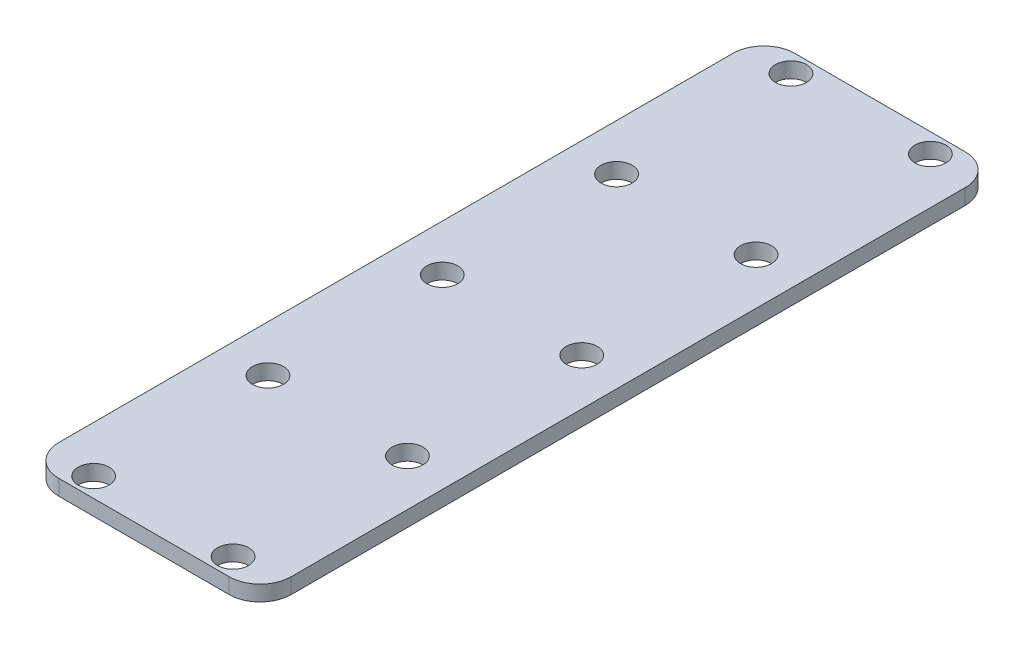
ISO-10303-21;
HEADER;
FILE_DESCRIPTION(('STEP AP214'),'2;1');
FILE_NAME('part.step','',(''),(''),'','','');
FILE_SCHEMA(('AUTOMOTIVE_DESIGN { 1 0 10303 214 1 1 1 1 }'));
ENDSEC;
DATA;
#1=APPLICATION_CONTEXT('core data for automotive mechanical design processes');
#2=APPLICATION_PROTOCOL_DEFINITION('international standard','automotive_design',2000,#1);
#3=PRODUCT_CONTEXT('',#1,'mechanical');
#4=PRODUCT('Part','Part','',(#3));
#5=PRODUCT_RELATED_PRODUCT_CATEGORY('part','',(#4));
#6=PRODUCT_DEFINITION_FORMATION('','',#4);
#7=PRODUCT_DEFINITION_CONTEXT('part definition',#1,'design');
#8=PRODUCT_DEFINITION('design','',#6,#7);
#9=PRODUCT_DEFINITION_SHAPE('','',#8);
#10=(LENGTH_UNIT() NAMED_UNIT(*) SI_UNIT(.MILLI.,.METRE.));
#11=(NAMED_UNIT(*) PLANE_ANGLE_UNIT() SI_UNIT($,.RADIAN.));
#12=(NAMED_UNIT(*) SI_UNIT($,.STERADIAN.) SOLID_ANGLE_UNIT());
#13=UNCERTAINTY_MEASURE_WITH_UNIT(LENGTH_MEASURE(1.E-05),#10,'distance_accuracy_value','');
#14=(GEOMETRIC_REPRESENTATION_CONTEXT(3) GLOBAL_UNCERTAINTY_ASSIGNED_CONTEXT((#13)) GLOBAL_UNIT_ASSIGNED_CONTEXT((#10,
#11,#12)) REPRESENTATION_CONTEXT('',''));
#15=CARTESIAN_POINT('',(0.,0.,0.));
#16=DIRECTION('',(0.,0.,1.));
#17=DIRECTION('',(1.,0.,0.));
#18=AXIS2_PLACEMENT_3D('',#15,#16,#17);
#19=CARTESIAN_POINT('',(0.,0.,0.));
#20=DIRECTION('',(0.,1.,0.));
#21=DIRECTION('',(1.,0.,0.));
#22=AXIS2_PLACEMENT_3D('',#19,#20,#21);
#23=PLANE('',#22);
#24=CARTESIAN_POINT('',(-9.,0.,0.));
#25=DIRECTION('',(0.,1.,0.));
#26=DIRECTION('',(0.,0.,1.));
#27=AXIS2_PLACEMENT_3D('',#24,#25,#26);
#28=CIRCLE('',#27,2.);
#29=CARTESIAN_POINT('',(-9.,0.,2.));
#30=VERTEX_POINT('',#29);
#31=EDGE_CURVE('E143',#30,#30,#28,.T.);
#32=ORIENTED_EDGE('',*,*,#31,.T.);
#33=EDGE_LOOP('',(#32));
#34=FACE_BOUND('',#33,.T.);
#35=CARTESIAN_POINT('',(-9.,0.,22.5));
#36=DIRECTION('',(0.,1.,0.));
#37=DIRECTION('',(0.,0.,1.));
#38=AXIS2_PLACEMENT_3D('',#35,#36,#37);
#39=CIRCLE('',#38,2.);
#40=CARTESIAN_POINT('',(-9.,0.,24.5));
#41=VERTEX_POINT('',#40);
#42=EDGE_CURVE('E180',#41,#41,#39,.T.);
#43=ORIENTED_EDGE('',*,*,#42,.T.);
#44=EDGE_LOOP('',(#43));
#45=FACE_BOUND('',#44,.T.);
#46=CARTESIAN_POINT('',(9.,0.,22.5));
#47=DIRECTION('',(0.,1.,0.));
#48=DIRECTION('',(0.,0.,1.));
#49=AXIS2_PLACEMENT_3D('',#46,#47,#48);
#50=CIRCLE('',#49,2.);
#51=CARTESIAN_POINT('',(9.,0.,24.5));
#52=VERTEX_POINT('',#51);
#53=EDGE_CURVE('E183',#52,#52,#50,.T.);
#54=ORIENTED_EDGE('',*,*,#53,.T.);
#55=EDGE_LOOP('',(#54));
#56=FACE_BOUND('',#55,.T.);
#57=CARTESIAN_POINT('',(-9.,0.,45.));
#58=DIRECTION('',(0.,1.,0.));
#59=DIRECTION('',(0.,0.,1.));
#60=AXIS2_PLACEMENT_3D('',#57,#58,#59);
#61=CIRCLE('',#60,2.);
#62=CARTESIAN_POINT('',(-9.,0.,47.));
#63=VERTEX_POINT('',#62);
#64=EDGE_CURVE('E186',#63,#63,#61,.T.);
#65=ORIENTED_EDGE('',*,*,#64,.T.);
#66=EDGE_LOOP('',(#65));
#67=FACE_BOUND('',#66,.T.);
#68=CARTESIAN_POINT('',(9.,0.,-45.));
#69=DIRECTION('',(0.,1.,0.));
#70=DIRECTION('',(0.,0.,1.));
#71=AXIS2_PLACEMENT_3D('',#68,#69,#70);
#72=CIRCLE('',#71,2.);
#73=CARTESIAN_POINT('',(9.,0.,-43.));
#74=VERTEX_POINT('',#73);
#75=EDGE_CURVE('E189',#74,#74,#72,.T.);
#76=ORIENTED_EDGE('',*,*,#75,.T.);
#77=EDGE_LOOP('',(#76));
#78=FACE_BOUND('',#77,.T.);
#79=CARTESIAN_POINT('',(-9.,0.,-22.5));
#80=DIRECTION('',(0.,1.,0.));
#81=DIRECTION('',(0.,0.,1.));
#82=AXIS2_PLACEMENT_3D('',#79,#80,#81);
#83=CIRCLE('',#82,2.00421482960565);
#84=CARTESIAN_POINT('',(-9.,0.,-20.4957851703943));
#85=VERTEX_POINT('',#84);
#86=EDGE_CURVE('E192',#85,#85,#83,.T.);
#87=ORIENTED_EDGE('',*,*,#86,.T.);
#88=EDGE_LOOP('',(#87));
#89=FACE_BOUND('',#88,.T.);
#90=CARTESIAN_POINT('',(9.,0.,-22.5));
#91=DIRECTION('',(0.,1.,0.));
#92=DIRECTION('',(0.,0.,1.));
#93=AXIS2_PLACEMENT_3D('',#90,#91,#92);
#94=CIRCLE('',#93,2.);
#95=CARTESIAN_POINT('',(9.,0.,-20.5));
#96=VERTEX_POINT('',#95);
#97=EDGE_CURVE('E195',#96,#96,#94,.T.);
#98=ORIENTED_EDGE('',*,*,#97,.T.);
#99=EDGE_LOOP('',(#98));
#100=FACE_BOUND('',#99,.T.);
#101=CARTESIAN_POINT('',(9.,0.,0.));
#102=DIRECTION('',(0.,1.,0.));
#103=DIRECTION('',(0.,0.,1.));
#104=AXIS2_PLACEMENT_3D('',#101,#102,#103);
#105=CIRCLE('',#104,2.);
#106=CARTESIAN_POINT('',(9.,0.,2.));
#107=VERTEX_POINT('',#106);
#108=EDGE_CURVE('E198',#107,#107,#105,.T.);
#109=ORIENTED_EDGE('',*,*,#108,.T.);
#110=EDGE_LOOP('',(#109));
#111=FACE_BOUND('',#110,.T.);
#112=CARTESIAN_POINT('',(9.,0.,45.));
#113=DIRECTION('',(0.,1.,0.));
#114=DIRECTION('',(0.,0.,1.));
#115=AXIS2_PLACEMENT_3D('',#112,#113,#114);
#116=CIRCLE('',#115,2.);
#117=CARTESIAN_POINT('',(9.,0.,47.));
#118=VERTEX_POINT('',#117);
#119=EDGE_CURVE('E201',#118,#118,#116,.T.);
#120=ORIENTED_EDGE('',*,*,#119,.T.);
#121=EDGE_LOOP('',(#120));
#122=FACE_BOUND('',#121,.T.);
#123=CARTESIAN_POINT('',(-9.,0.,-45.));
#124=DIRECTION('',(0.,1.,0.));
#125=DIRECTION('',(0.,0.,1.));
#126=AXIS2_PLACEMENT_3D('',#123,#124,#125);
#127=CIRCLE('',#126,2.);
#128=CARTESIAN_POINT('',(-9.,0.,-43.));
#129=VERTEX_POINT('',#128);
#130=EDGE_CURVE('E204',#129,#129,#127,.T.);
#131=ORIENTED_EDGE('',*,*,#130,.T.);
#132=EDGE_LOOP('',(#131));
#133=FACE_BOUND('',#132,.T.);
#134=DIRECTION('',(1.,0.,0.));
#135=VECTOR('',#134,1.);
#136=CARTESIAN_POINT('',(-11.,0.,47.5));
#137=LINE('',#136,#135);
#138=CARTESIAN_POINT('',(-11.,0.,47.5));
#139=VERTEX_POINT('',#138);
#140=CARTESIAN_POINT('',(11.,0.,47.5));
#141=VERTEX_POINT('',#140);
#142=EDGE_CURVE('E60',#139,#141,#137,.T.);
#143=ORIENTED_EDGE('',*,*,#142,.F.);
#144=CARTESIAN_POINT('',(-11.,0.,43.5));
#145=DIRECTION('',(0.,-1.,0.));
#146=DIRECTION('',(0.,0.,1.));
#147=AXIS2_PLACEMENT_3D('',#144,#145,#146);
#148=CIRCLE('',#147,4.);
#149=CARTESIAN_POINT('',(-15.,0.,43.5));
#150=VERTEX_POINT('',#149);
#151=EDGE_CURVE('E11',#139,#150,#148,.T.);
#152=ORIENTED_EDGE('',*,*,#151,.T.);
#153=DIRECTION('',(0.,0.,1.));
#154=VECTOR('',#153,1.);
#155=CARTESIAN_POINT('',(-15.,0.,-43.5));
#156=LINE('',#155,#154);
#157=CARTESIAN_POINT('',(-15.,0.,-43.5));
#158=VERTEX_POINT('',#157);
#159=EDGE_CURVE('E131',#158,#150,#156,.T.);
#160=ORIENTED_EDGE('',*,*,#159,.F.);
#161=CARTESIAN_POINT('',(-11.,0.,-43.5));
#162=DIRECTION('',(0.,-1.,0.));
#163=DIRECTION('',(-1.,0.,0.));
#164=AXIS2_PLACEMENT_3D('',#161,#162,#163);
#165=CIRCLE('',#164,4.);
#166=CARTESIAN_POINT('',(-11.,0.,-47.5));
#167=VERTEX_POINT('',#166);
#168=EDGE_CURVE('E52',#158,#167,#165,.T.);
#169=ORIENTED_EDGE('',*,*,#168,.T.);
#170=DIRECTION('',(1.,0.,0.));
#171=VECTOR('',#170,1.);
#172=CARTESIAN_POINT('',(-11.,0.,-47.5));
#173=LINE('',#172,#171);
#174=CARTESIAN_POINT('',(11.,0.,-47.5));
#175=VERTEX_POINT('',#174);
#176=EDGE_CURVE('E144',#167,#175,#173,.T.);
#177=ORIENTED_EDGE('',*,*,#176,.T.);
#178=CARTESIAN_POINT('',(11.,0.,-43.5));
#179=DIRECTION('',(0.,-1.,0.));
#180=DIRECTION('',(0.,0.,-1.));
#181=AXIS2_PLACEMENT_3D('',#178,#179,#180);
#182=CIRCLE('',#181,4.);
#183=CARTESIAN_POINT('',(15.,0.,-43.5));
#184=VERTEX_POINT('',#183);
#185=EDGE_CURVE('E147',#175,#184,#182,.T.);
#186=ORIENTED_EDGE('',*,*,#185,.T.);
#187=DIRECTION('',(0.,0.,-1.));
#188=VECTOR('',#187,1.);
#189=CARTESIAN_POINT('',(15.,0.,43.5));
#190=LINE('',#189,#188);
#191=CARTESIAN_POINT('',(15.,0.,43.5));
#192=VERTEX_POINT('',#191);
#193=EDGE_CURVE('E159',#192,#184,#190,.T.);
#194=ORIENTED_EDGE('',*,*,#193,.F.);
#195=CARTESIAN_POINT('',(11.,0.,43.5));
#196=DIRECTION('',(0.,-1.,0.));
#197=DIRECTION('',(1.,0.,0.));
#198=AXIS2_PLACEMENT_3D('',#195,#196,#197);
#199=CIRCLE('',#198,4.);
#200=EDGE_CURVE('E165',#192,#141,#199,.T.);
#201=ORIENTED_EDGE('',*,*,#200,.T.);
#202=EDGE_LOOP('',(#143,#152,#160,#169,#177,#186,#194,#201));
#203=FACE_BOUND('',#202,.T.);
#204=ADVANCED_FACE('F42',(#34,#45,#56,#67,#78,#89,#100,#111,#122,#133,#203),#23,.F.);
#205=CARTESIAN_POINT('',(0.,2.,0.));
#206=DIRECTION('',(0.,1.,0.));
#207=DIRECTION('',(1.,0.,0.));
#208=AXIS2_PLACEMENT_3D('',#205,#206,#207);
#209=PLANE('',#208);
#210=CARTESIAN_POINT('',(-9.,2.,0.));
#211=DIRECTION('',(0.,1.,0.));
#212=DIRECTION('',(0.,0.,1.));
#213=AXIS2_PLACEMENT_3D('',#210,#211,#212);
#214=CIRCLE('',#213,2.);
#215=CARTESIAN_POINT('',(-9.,2.,2.));
#216=VERTEX_POINT('',#215);
#217=EDGE_CURVE('E220',#216,#216,#214,.T.);
#218=ORIENTED_EDGE('',*,*,#217,.F.);
#219=EDGE_LOOP('',(#218));
#220=FACE_BOUND('',#219,.T.);
#221=CARTESIAN_POINT('',(-9.,2.,22.5));
#222=DIRECTION('',(0.,1.,0.));
#223=DIRECTION('',(0.,0.,1.));
#224=AXIS2_PLACEMENT_3D('',#221,#222,#223);
#225=CIRCLE('',#224,2.);
#226=CARTESIAN_POINT('',(-9.,2.,24.5));
#227=VERTEX_POINT('',#226);
#228=EDGE_CURVE('E223',#227,#227,#225,.T.);
#229=ORIENTED_EDGE('',*,*,#228,.F.);
#230=EDGE_LOOP('',(#229));
#231=FACE_BOUND('',#230,.T.);
#232=CARTESIAN_POINT('',(9.,2.,22.5));
#233=DIRECTION('',(0.,1.,0.));
#234=DIRECTION('',(0.,0.,1.));
#235=AXIS2_PLACEMENT_3D('',#232,#233,#234);
#236=CIRCLE('',#235,2.);
#237=CARTESIAN_POINT('',(9.,2.,24.5));
#238=VERTEX_POINT('',#237);
#239=EDGE_CURVE('E226',#238,#238,#236,.T.);
#240=ORIENTED_EDGE('',*,*,#239,.F.);
#241=EDGE_LOOP('',(#240));
#242=FACE_BOUND('',#241,.T.);
#243=CARTESIAN_POINT('',(-9.,2.,45.));
#244=DIRECTION('',(0.,1.,0.));
#245=DIRECTION('',(0.,0.,1.));
#246=AXIS2_PLACEMENT_3D('',#243,#244,#245);
#247=CIRCLE('',#246,2.);
#248=CARTESIAN_POINT('',(-9.,2.,47.));
#249=VERTEX_POINT('',#248);
#250=EDGE_CURVE('E229',#249,#249,#247,.T.);
#251=ORIENTED_EDGE('',*,*,#250,.F.);
#252=EDGE_LOOP('',(#251));
#253=FACE_BOUND('',#252,.T.);
#254=CARTESIAN_POINT('',(9.,2.,-45.));
#255=DIRECTION('',(0.,1.,0.));
#256=DIRECTION('',(0.,0.,1.));
#257=AXIS2_PLACEMENT_3D('',#254,#255,#256);
#258=CIRCLE('',#257,2.);
#259=CARTESIAN_POINT('',(9.,2.,-43.));
#260=VERTEX_POINT('',#259);
#261=EDGE_CURVE('E210',#260,#260,#258,.T.);
#262=ORIENTED_EDGE('',*,*,#261,.F.);
#263=EDGE_LOOP('',(#262));
#264=FACE_BOUND('',#263,.T.);
#265=CARTESIAN_POINT('',(-9.,2.,-22.5));
#266=DIRECTION('',(0.,1.,0.));
#267=DIRECTION('',(0.,0.,1.));
#268=AXIS2_PLACEMENT_3D('',#265,#266,#267);
#269=CIRCLE('',#268,2.00421482960565);
#270=CARTESIAN_POINT('',(-9.,2.,-20.4957851703943));
#271=VERTEX_POINT('',#270);
#272=EDGE_CURVE('E211',#271,#271,#269,.T.);
#273=ORIENTED_EDGE('',*,*,#272,.F.);
#274=EDGE_LOOP('',(#273));
#275=FACE_BOUND('',#274,.T.);
#276=CARTESIAN_POINT('',(9.,2.,-22.5));
#277=DIRECTION('',(0.,1.,0.));
#278=DIRECTION('',(0.,0.,1.));
#279=AXIS2_PLACEMENT_3D('',#276,#277,#278);
#280=CIRCLE('',#279,2.);
#281=CARTESIAN_POINT('',(9.,2.,-20.5));
#282=VERTEX_POINT('',#281);
#283=EDGE_CURVE('E214',#282,#282,#280,.T.);
#284=ORIENTED_EDGE('',*,*,#283,.F.);
#285=EDGE_LOOP('',(#284));
#286=FACE_BOUND('',#285,.T.);
#287=CARTESIAN_POINT('',(9.,2.,0.));
#288=DIRECTION('',(0.,1.,0.));
#289=DIRECTION('',(0.,0.,1.));
#290=AXIS2_PLACEMENT_3D('',#287,#288,#289);
#291=CIRCLE('',#290,2.);
#292=CARTESIAN_POINT('',(9.,2.,2.));
#293=VERTEX_POINT('',#292);
#294=EDGE_CURVE('E217',#293,#293,#291,.T.);
#295=ORIENTED_EDGE('',*,*,#294,.F.);
#296=EDGE_LOOP('',(#295));
#297=FACE_BOUND('',#296,.T.);
#298=CARTESIAN_POINT('',(9.,2.,45.));
#299=DIRECTION('',(0.,1.,0.));
#300=DIRECTION('',(0.,0.,1.));
#301=AXIS2_PLACEMENT_3D('',#298,#299,#300);
#302=CIRCLE('',#301,2.);
#303=CARTESIAN_POINT('',(9.,2.,47.));
#304=VERTEX_POINT('',#303);
#305=EDGE_CURVE('E232',#304,#304,#302,.T.);
#306=ORIENTED_EDGE('',*,*,#305,.F.);
#307=EDGE_LOOP('',(#306));
#308=FACE_BOUND('',#307,.T.);
#309=CARTESIAN_POINT('',(-9.,2.,-45.));
#310=DIRECTION('',(0.,1.,0.));
#311=DIRECTION('',(0.,0.,1.));
#312=AXIS2_PLACEMENT_3D('',#309,#310,#311);
#313=CIRCLE('',#312,2.);
#314=CARTESIAN_POINT('',(-9.,2.,-43.));
#315=VERTEX_POINT('',#314);
#316=EDGE_CURVE('E207',#315,#315,#313,.T.);
#317=ORIENTED_EDGE('',*,*,#316,.F.);
#318=EDGE_LOOP('',(#317));
#319=FACE_BOUND('',#318,.T.);
#320=DIRECTION('',(0.,0.,-1.));
#321=VECTOR('',#320,1.);
#322=CARTESIAN_POINT('',(15.,2.,43.5));
#323=LINE('',#322,#321);
#324=CARTESIAN_POINT('',(15.,2.,43.5));
#325=VERTEX_POINT('',#324);
#326=CARTESIAN_POINT('',(15.,2.,-43.5));
#327=VERTEX_POINT('',#326);
#328=EDGE_CURVE('E164',#325,#327,#323,.T.);
#329=ORIENTED_EDGE('',*,*,#328,.T.);
#330=CARTESIAN_POINT('',(11.,2.,-43.5));
#331=DIRECTION('',(0.,1.,0.));
#332=DIRECTION('',(1.,0.,0.));
#333=AXIS2_PLACEMENT_3D('',#330,#331,#332);
#334=CIRCLE('',#333,4.);
#335=CARTESIAN_POINT('',(11.,2.,-47.5));
#336=VERTEX_POINT('',#335);
#337=EDGE_CURVE('E166',#327,#336,#334,.T.);
#338=ORIENTED_EDGE('',*,*,#337,.T.);
#339=DIRECTION('',(1.,0.,0.));
#340=VECTOR('',#339,1.);
#341=CARTESIAN_POINT('',(-11.,2.,-47.5));
#342=LINE('',#341,#340);
#343=CARTESIAN_POINT('',(-11.,2.,-47.5));
#344=VERTEX_POINT('',#343);
#345=EDGE_CURVE('E92',#344,#336,#342,.T.);
#346=ORIENTED_EDGE('',*,*,#345,.F.);
#347=CARTESIAN_POINT('',(-11.,2.,-43.5));
#348=DIRECTION('',(0.,1.,0.));
#349=DIRECTION('',(0.,0.,-1.));
#350=AXIS2_PLACEMENT_3D('',#347,#348,#349);
#351=CIRCLE('',#350,4.);
#352=CARTESIAN_POINT('',(-15.,2.,-43.5));
#353=VERTEX_POINT('',#352);
#354=EDGE_CURVE('E125',#344,#353,#351,.T.);
#355=ORIENTED_EDGE('',*,*,#354,.T.);
#356=DIRECTION('',(0.,0.,1.));
#357=VECTOR('',#356,1.);
#358=CARTESIAN_POINT('',(-15.,2.,-43.5));
#359=LINE('',#358,#357);
#360=CARTESIAN_POINT('',(-15.,2.,43.5));
#361=VERTEX_POINT('',#360);
#362=EDGE_CURVE('E120',#353,#361,#359,.T.);
#363=ORIENTED_EDGE('',*,*,#362,.T.);
#364=CARTESIAN_POINT('',(-11.,2.,43.5));
#365=DIRECTION('',(0.,1.,0.));
#366=DIRECTION('',(-1.,0.,0.));
#367=AXIS2_PLACEMENT_3D('',#364,#365,#366);
#368=CIRCLE('',#367,4.);
#369=CARTESIAN_POINT('',(-11.,2.,47.5));
#370=VERTEX_POINT('',#369);
#371=EDGE_CURVE('E112',#361,#370,#368,.T.);
#372=ORIENTED_EDGE('',*,*,#371,.T.);
#373=DIRECTION('',(1.,0.,0.));
#374=VECTOR('',#373,1.);
#375=CARTESIAN_POINT('',(-11.,2.,47.5));
#376=LINE('',#375,#374);
#377=CARTESIAN_POINT('',(11.,2.,47.5));
#378=VERTEX_POINT('',#377);
#379=EDGE_CURVE('E121',#370,#378,#376,.T.);
#380=ORIENTED_EDGE('',*,*,#379,.T.);
#381=CARTESIAN_POINT('',(11.,2.,43.5));
#382=DIRECTION('',(0.,1.,0.));
#383=DIRECTION('',(0.,0.,1.));
#384=AXIS2_PLACEMENT_3D('',#381,#382,#383);
#385=CIRCLE('',#384,4.);
#386=EDGE_CURVE('E148',#378,#325,#385,.T.);
#387=ORIENTED_EDGE('',*,*,#386,.T.);
#388=EDGE_LOOP('',(#329,#338,#346,#355,#363,#372,#380,#387));
#389=FACE_BOUND('',#388,.T.);
#390=ADVANCED_FACE('F124',(#220,#231,#242,#253,#264,#275,#286,#297,#308,#319,#389),#209,.T.);
#391=CARTESIAN_POINT('',(11.,7.012,43.5));
#392=DIRECTION('',(0.,-1.,0.));
#393=DIRECTION('',(1.,0.,0.));
#394=AXIS2_PLACEMENT_3D('',#391,#392,#393);
#395=CYLINDRICAL_SURFACE('',#394,4.);
#396=DIRECTION('',(0.,-1.,0.));
#397=VECTOR('',#396,1.);
#398=CARTESIAN_POINT('',(15.,2.,43.5));
#399=LINE('',#398,#397);
#400=EDGE_CURVE('E139',#325,#192,#399,.T.);
#401=ORIENTED_EDGE('',*,*,#400,.F.);
#402=ORIENTED_EDGE('',*,*,#386,.F.);
#403=DIRECTION('',(0.,-1.,0.));
#404=VECTOR('',#403,1.);
#405=CARTESIAN_POINT('',(11.,2.,47.5));
#406=LINE('',#405,#404);
#407=EDGE_CURVE('E46',#378,#141,#406,.T.);
#408=ORIENTED_EDGE('',*,*,#407,.T.);
#409=ORIENTED_EDGE('',*,*,#200,.F.);
#410=EDGE_LOOP('',(#401,#402,#408,#409));
#411=FACE_BOUND('',#410,.T.);
#412=ADVANCED_FACE('F243',(#411),#395,.T.);
#413=CARTESIAN_POINT('',(15.,2.,47.5));
#414=DIRECTION('',(0.,0.,-1.));
#415=DIRECTION('',(0.,-1.,0.));
#416=AXIS2_PLACEMENT_3D('',#413,#414,#415);
#417=PLANE('',#416);
#418=ORIENTED_EDGE('',*,*,#379,.F.);
#419=DIRECTION('',(0.,1.,0.));
#420=VECTOR('',#419,1.);
#421=CARTESIAN_POINT('',(-11.,0.,47.5));
#422=LINE('',#421,#420);
#423=EDGE_CURVE('E118',#139,#370,#422,.T.);
#424=ORIENTED_EDGE('',*,*,#423,.F.);
#425=ORIENTED_EDGE('',*,*,#142,.T.);
#426=ORIENTED_EDGE('',*,*,#407,.F.);
#427=EDGE_LOOP('',(#418,#424,#425,#426));
#428=FACE_BOUND('',#427,.T.);
#429=ADVANCED_FACE('F263',(#428),#417,.F.);
#430=CARTESIAN_POINT('',(-11.,-5.012,43.5));
#431=DIRECTION('',(0.,1.,0.));
#432=DIRECTION('',(-1.,0.,0.));
#433=AXIS2_PLACEMENT_3D('',#430,#431,#432);
#434=CYLINDRICAL_SURFACE('',#433,4.);
#435=DIRECTION('',(0.,1.,0.));
#436=VECTOR('',#435,1.);
#437=CARTESIAN_POINT('',(-15.,0.,43.5));
#438=LINE('',#437,#436);
#439=EDGE_CURVE('E116',#150,#361,#438,.T.);
#440=ORIENTED_EDGE('',*,*,#439,.F.);
#441=ORIENTED_EDGE('',*,*,#151,.F.);
#442=ORIENTED_EDGE('',*,*,#423,.T.);
#443=ORIENTED_EDGE('',*,*,#371,.F.);
#444=EDGE_LOOP('',(#440,#441,#442,#443));
#445=FACE_BOUND('',#444,.T.);
#446=ADVANCED_FACE('F114',(#445),#434,.T.);
#447=CARTESIAN_POINT('',(-15.,0.,-67.5));
#448=DIRECTION('',(-1.,0.,0.));
#449=DIRECTION('',(0.,0.,1.));
#450=AXIS2_PLACEMENT_3D('',#447,#448,#449);
#451=PLANE('',#450);
#452=ORIENTED_EDGE('',*,*,#362,.F.);
#453=DIRECTION('',(0.,-1.,0.));
#454=VECTOR('',#453,1.);
#455=CARTESIAN_POINT('',(-15.,2.,-43.5));
#456=LINE('',#455,#454);
#457=EDGE_CURVE('E134',#353,#158,#456,.T.);
#458=ORIENTED_EDGE('',*,*,#457,.T.);
#459=ORIENTED_EDGE('',*,*,#159,.T.);
#460=ORIENTED_EDGE('',*,*,#439,.T.);
#461=EDGE_LOOP('',(#452,#458,#459,#460));
#462=FACE_BOUND('',#461,.T.);
#463=ADVANCED_FACE('F130',(#462),#451,.T.);
#464=CARTESIAN_POINT('',(-11.,7.012,-43.5));
#465=DIRECTION('',(0.,-1.,0.));
#466=DIRECTION('',(-1.,0.,0.));
#467=AXIS2_PLACEMENT_3D('',#464,#465,#466);
#468=CYLINDRICAL_SURFACE('',#467,4.);
#469=ORIENTED_EDGE('',*,*,#457,.F.);
#470=ORIENTED_EDGE('',*,*,#354,.F.);
#471=DIRECTION('',(0.,-1.,0.));
#472=VECTOR('',#471,1.);
#473=CARTESIAN_POINT('',(-11.,2.,-47.5));
#474=LINE('',#473,#472);
#475=EDGE_CURVE('E132',#344,#167,#474,.T.);
#476=ORIENTED_EDGE('',*,*,#475,.T.);
#477=ORIENTED_EDGE('',*,*,#168,.F.);
#478=EDGE_LOOP('',(#469,#470,#476,#477));
#479=FACE_BOUND('',#478,.T.);
#480=ADVANCED_FACE('F154',(#479),#468,.T.);
#481=CARTESIAN_POINT('',(-15.,2.,-47.5));
#482=DIRECTION('',(0.,0.,1.));
#483=DIRECTION('',(1.,0.,0.));
#484=AXIS2_PLACEMENT_3D('',#481,#482,#483);
#485=PLANE('',#484);
#486=ORIENTED_EDGE('',*,*,#176,.F.);
#487=ORIENTED_EDGE('',*,*,#475,.F.);
#488=ORIENTED_EDGE('',*,*,#345,.T.);
#489=DIRECTION('',(0.,1.,0.));
#490=VECTOR('',#489,1.);
#491=CARTESIAN_POINT('',(11.,0.,-47.5));
#492=LINE('',#491,#490);
#493=EDGE_CURVE('E157',#175,#336,#492,.T.);
#494=ORIENTED_EDGE('',*,*,#493,.F.);
#495=EDGE_LOOP('',(#486,#487,#488,#494));
#496=FACE_BOUND('',#495,.T.);
#497=ADVANCED_FACE('F155',(#496),#485,.F.);
#498=CARTESIAN_POINT('',(11.,-5.012,-43.5));
#499=DIRECTION('',(0.,1.,0.));
#500=DIRECTION('',(1.,0.,0.));
#501=AXIS2_PLACEMENT_3D('',#498,#499,#500);
#502=CYLINDRICAL_SURFACE('',#501,4.);
#503=DIRECTION('',(0.,1.,0.));
#504=VECTOR('',#503,1.);
#505=CARTESIAN_POINT('',(15.,0.,-43.5));
#506=LINE('',#505,#504);
#507=EDGE_CURVE('E142',#184,#327,#506,.T.);
#508=ORIENTED_EDGE('',*,*,#507,.F.);
#509=ORIENTED_EDGE('',*,*,#185,.F.);
#510=ORIENTED_EDGE('',*,*,#493,.T.);
#511=ORIENTED_EDGE('',*,*,#337,.F.);
#512=EDGE_LOOP('',(#508,#509,#510,#511));
#513=FACE_BOUND('',#512,.T.);
#514=ADVANCED_FACE('F268',(#513),#502,.T.);
#515=CARTESIAN_POINT('',(15.,0.,67.5));
#516=DIRECTION('',(1.,0.,0.));
#517=DIRECTION('',(0.,1.,0.));
#518=AXIS2_PLACEMENT_3D('',#515,#516,#517);
#519=PLANE('',#518);
#520=ORIENTED_EDGE('',*,*,#193,.T.);
#521=ORIENTED_EDGE('',*,*,#507,.T.);
#522=ORIENTED_EDGE('',*,*,#328,.F.);
#523=ORIENTED_EDGE('',*,*,#400,.T.);
#524=EDGE_LOOP('',(#520,#521,#522,#523));
#525=FACE_BOUND('',#524,.T.);
#526=ADVANCED_FACE('F44',(#525),#519,.T.);
#527=CARTESIAN_POINT('',(-9.,-8.,-45.));
#528=DIRECTION('',(0.,1.,0.));
#529=DIRECTION('',(0.,0.,1.));
#530=AXIS2_PLACEMENT_3D('',#527,#528,#529);
#531=CYLINDRICAL_SURFACE('',#530,2.);
#532=ORIENTED_EDGE('',*,*,#316,.T.);
#533=EDGE_LOOP('',(#532));
#534=FACE_BOUND('',#533,.T.);
#535=ORIENTED_EDGE('',*,*,#130,.F.);
#536=EDGE_LOOP('',(#535));
#537=FACE_BOUND('',#536,.T.);
#538=ADVANCED_FACE('F248',(#534,#537),#531,.F.);
#539=CARTESIAN_POINT('',(9.,-8.,45.));
#540=DIRECTION('',(0.,1.,0.));
#541=DIRECTION('',(0.,0.,1.));
#542=AXIS2_PLACEMENT_3D('',#539,#540,#541);
#543=CYLINDRICAL_SURFACE('',#542,2.);
#544=ORIENTED_EDGE('',*,*,#305,.T.);
#545=EDGE_LOOP('',(#544));
#546=FACE_BOUND('',#545,.T.);
#547=ORIENTED_EDGE('',*,*,#119,.F.);
#548=EDGE_LOOP('',(#547));
#549=FACE_BOUND('',#548,.T.);
#550=ADVANCED_FACE('F238',(#546,#549),#543,.F.);
#551=CARTESIAN_POINT('',(9.,-8.,0.));
#552=DIRECTION('',(0.,1.,0.));
#553=DIRECTION('',(0.,0.,1.));
#554=AXIS2_PLACEMENT_3D('',#551,#552,#553);
#555=CYLINDRICAL_SURFACE('',#554,2.);
#556=ORIENTED_EDGE('',*,*,#294,.T.);
#557=EDGE_LOOP('',(#556));
#558=FACE_BOUND('',#557,.T.);
#559=ORIENTED_EDGE('',*,*,#108,.F.);
#560=EDGE_LOOP('',(#559));
#561=FACE_BOUND('',#560,.T.);
#562=ADVANCED_FACE('F308',(#558,#561),#555,.F.);
#563=CARTESIAN_POINT('',(9.,-8.,-22.5));
#564=DIRECTION('',(0.,1.,0.));
#565=DIRECTION('',(0.,0.,1.));
#566=AXIS2_PLACEMENT_3D('',#563,#564,#565);
#567=CYLINDRICAL_SURFACE('',#566,2.);
#568=ORIENTED_EDGE('',*,*,#283,.T.);
#569=EDGE_LOOP('',(#568));
#570=FACE_BOUND('',#569,.T.);
#571=ORIENTED_EDGE('',*,*,#97,.F.);
#572=EDGE_LOOP('',(#571));
#573=FACE_BOUND('',#572,.T.);
#574=ADVANCED_FACE('F315',(#570,#573),#567,.F.);
#575=CARTESIAN_POINT('',(-9.,-8.,-22.5));
#576=DIRECTION('',(0.,1.,0.));
#577=DIRECTION('',(0.,0.,1.));
#578=AXIS2_PLACEMENT_3D('',#575,#576,#577);
#579=CYLINDRICAL_SURFACE('',#578,2.00421482960565);
#580=ORIENTED_EDGE('',*,*,#272,.T.);
#581=EDGE_LOOP('',(#580));
#582=FACE_BOUND('',#581,.T.);
#583=ORIENTED_EDGE('',*,*,#86,.F.);
#584=EDGE_LOOP('',(#583));
#585=FACE_BOUND('',#584,.T.);
#586=ADVANCED_FACE('F323',(#582,#585),#579,.F.);
#587=CARTESIAN_POINT('',(9.,-8.,-45.));
#588=DIRECTION('',(0.,1.,0.));
#589=DIRECTION('',(0.,0.,1.));
#590=AXIS2_PLACEMENT_3D('',#587,#588,#589);
#591=CYLINDRICAL_SURFACE('',#590,2.);
#592=ORIENTED_EDGE('',*,*,#261,.T.);
#593=EDGE_LOOP('',(#592));
#594=FACE_BOUND('',#593,.T.);
#595=ORIENTED_EDGE('',*,*,#75,.F.);
#596=EDGE_LOOP('',(#595));
#597=FACE_BOUND('',#596,.T.);
#598=ADVANCED_FACE('F331',(#594,#597),#591,.F.);
#599=CARTESIAN_POINT('',(-9.,-8.,45.));
#600=DIRECTION('',(0.,1.,0.));
#601=DIRECTION('',(0.,0.,1.));
#602=AXIS2_PLACEMENT_3D('',#599,#600,#601);
#603=CYLINDRICAL_SURFACE('',#602,2.);
#604=ORIENTED_EDGE('',*,*,#250,.T.);
#605=EDGE_LOOP('',(#604));
#606=FACE_BOUND('',#605,.T.);
#607=ORIENTED_EDGE('',*,*,#64,.F.);
#608=EDGE_LOOP('',(#607));
#609=FACE_BOUND('',#608,.T.);
#610=ADVANCED_FACE('F338',(#606,#609),#603,.F.);
#611=CARTESIAN_POINT('',(9.,-8.,22.5));
#612=DIRECTION('',(0.,1.,0.));
#613=DIRECTION('',(0.,0.,1.));
#614=AXIS2_PLACEMENT_3D('',#611,#612,#613);
#615=CYLINDRICAL_SURFACE('',#614,2.);
#616=ORIENTED_EDGE('',*,*,#239,.T.);
#617=EDGE_LOOP('',(#616));
#618=FACE_BOUND('',#617,.T.);
#619=ORIENTED_EDGE('',*,*,#53,.F.);
#620=EDGE_LOOP('',(#619));
#621=FACE_BOUND('',#620,.T.);
#622=ADVANCED_FACE('F346',(#618,#621),#615,.F.);
#623=CARTESIAN_POINT('',(-9.,-8.,22.5));
#624=DIRECTION('',(0.,1.,0.));
#625=DIRECTION('',(0.,0.,1.));
#626=AXIS2_PLACEMENT_3D('',#623,#624,#625);
#627=CYLINDRICAL_SURFACE('',#626,2.);
#628=ORIENTED_EDGE('',*,*,#228,.T.);
#629=EDGE_LOOP('',(#628));
#630=FACE_BOUND('',#629,.T.);
#631=ORIENTED_EDGE('',*,*,#42,.F.);
#632=EDGE_LOOP('',(#631));
#633=FACE_BOUND('',#632,.T.);
#634=ADVANCED_FACE('F354',(#630,#633),#627,.F.);
#635=CARTESIAN_POINT('',(-9.,-8.,0.));
#636=DIRECTION('',(0.,1.,0.));
#637=DIRECTION('',(0.,0.,1.));
#638=AXIS2_PLACEMENT_3D('',#635,#636,#637);
#639=CYLINDRICAL_SURFACE('',#638,2.);
#640=ORIENTED_EDGE('',*,*,#217,.T.);
#641=EDGE_LOOP('',(#640));
#642=FACE_BOUND('',#641,.T.);
#643=ORIENTED_EDGE('',*,*,#31,.F.);
#644=EDGE_LOOP('',(#643));
#645=FACE_BOUND('',#644,.T.);
#646=ADVANCED_FACE('F362',(#642,#645),#639,.F.);
#647=CLOSED_SHELL('',(#204,#390,#412,#429,#446,#463,#480,#497,#514,#526,#538,#550,#562,#574,
#586,#598,#610,#622,#634,#646));
#648=MANIFOLD_SOLID_BREP('B2',#647);
#649=ADVANCED_BREP_SHAPE_REPRESENTATION('',(#18,#648),#14);
#650=SHAPE_DEFINITION_REPRESENTATION(#9,#649);
ENDSEC;
END-ISO-10303-21;
